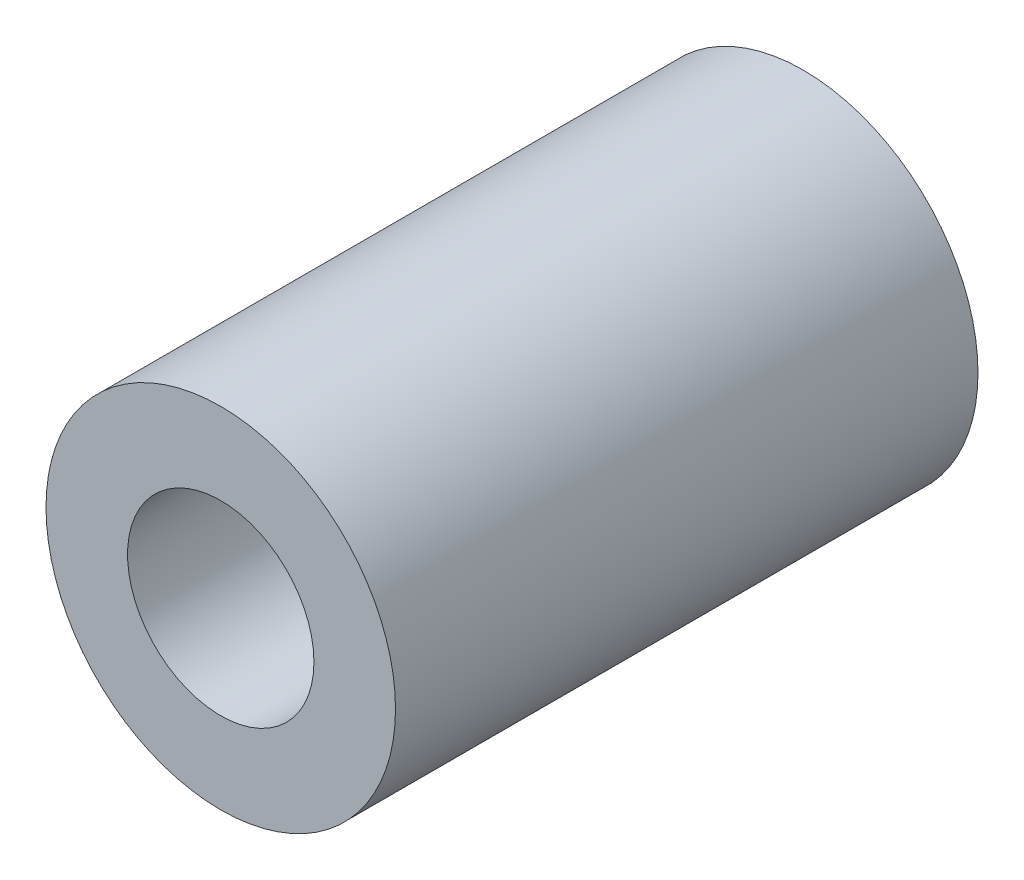
ISO-10303-21;
HEADER;
FILE_DESCRIPTION(('STEP AP214'),'2;1');
FILE_NAME('part.step','',(''),(''),'','','');
FILE_SCHEMA(('AUTOMOTIVE_DESIGN { 1 0 10303 214 1 1 1 1 }'));
ENDSEC;
DATA;
#1=APPLICATION_CONTEXT('core data for automotive mechanical design processes');
#2=APPLICATION_PROTOCOL_DEFINITION('international standard','automotive_design',2000,#1);
#3=PRODUCT_CONTEXT('',#1,'mechanical');
#4=PRODUCT('Part','Part','',(#3));
#5=PRODUCT_RELATED_PRODUCT_CATEGORY('part','',(#4));
#6=PRODUCT_DEFINITION_FORMATION('','',#4);
#7=PRODUCT_DEFINITION_CONTEXT('part definition',#1,'design');
#8=PRODUCT_DEFINITION('design','',#6,#7);
#9=PRODUCT_DEFINITION_SHAPE('','',#8);
#10=(LENGTH_UNIT() NAMED_UNIT(*) SI_UNIT(.MILLI.,.METRE.));
#11=(NAMED_UNIT(*) PLANE_ANGLE_UNIT() SI_UNIT($,.RADIAN.));
#12=(NAMED_UNIT(*) SI_UNIT($,.STERADIAN.) SOLID_ANGLE_UNIT());
#13=UNCERTAINTY_MEASURE_WITH_UNIT(LENGTH_MEASURE(1.E-05),#10,'distance_accuracy_value','');
#14=(GEOMETRIC_REPRESENTATION_CONTEXT(3) GLOBAL_UNCERTAINTY_ASSIGNED_CONTEXT((#13)) GLOBAL_UNIT_ASSIGNED_CONTEXT((#10,
#11,#12)) REPRESENTATION_CONTEXT('',''));
#15=CARTESIAN_POINT('',(0.,0.,0.));
#16=DIRECTION('',(0.,0.,1.));
#17=DIRECTION('',(1.,0.,0.));
#18=AXIS2_PLACEMENT_3D('',#15,#16,#17);
#19=CARTESIAN_POINT('',(0.,0.,10.));
#20=DIRECTION('',(0.,0.,1.));
#21=DIRECTION('',(1.,0.,0.));
#22=AXIS2_PLACEMENT_3D('',#19,#20,#21);
#23=PLANE('',#22);
#24=CARTESIAN_POINT('',(0.,0.,10.));
#25=DIRECTION('',(0.,0.,1.));
#26=DIRECTION('',(1.,0.,0.));
#27=AXIS2_PLACEMENT_3D('',#24,#25,#26);
#28=CIRCLE('',#27,3.);
#29=CARTESIAN_POINT('',(3.,0.,10.));
#30=VERTEX_POINT('',#29);
#31=EDGE_CURVE('E10',#30,#30,#28,.T.);
#32=ORIENTED_EDGE('',*,*,#31,.T.);
#33=EDGE_LOOP('',(#32));
#34=FACE_BOUND('',#33,.T.);
#35=CARTESIAN_POINT('',(0.,0.,10.));
#36=DIRECTION('',(0.,0.,1.));
#37=DIRECTION('',(1.,0.,0.));
#38=AXIS2_PLACEMENT_3D('',#35,#36,#37);
#39=CIRCLE('',#38,1.6);
#40=CARTESIAN_POINT('',(1.6,0.,10.));
#41=VERTEX_POINT('',#40);
#42=EDGE_CURVE('E48',#41,#41,#39,.T.);
#43=ORIENTED_EDGE('',*,*,#42,.F.);
#44=EDGE_LOOP('',(#43));
#45=FACE_BOUND('',#44,.T.);
#46=ADVANCED_FACE('F37',(#34,#45),#23,.T.);
#47=CARTESIAN_POINT('',(0.,0.,0.));
#48=DIRECTION('',(0.,0.,1.));
#49=DIRECTION('',(1.,0.,0.));
#50=AXIS2_PLACEMENT_3D('',#47,#48,#49);
#51=PLANE('',#50);
#52=CARTESIAN_POINT('',(0.,0.,0.));
#53=DIRECTION('',(0.,0.,1.));
#54=DIRECTION('',(1.,0.,0.));
#55=AXIS2_PLACEMENT_3D('',#52,#53,#54);
#56=CIRCLE('',#55,3.);
#57=CARTESIAN_POINT('',(3.,0.,0.));
#58=VERTEX_POINT('',#57);
#59=EDGE_CURVE('E41',#58,#58,#56,.T.);
#60=ORIENTED_EDGE('',*,*,#59,.F.);
#61=EDGE_LOOP('',(#60));
#62=FACE_BOUND('',#61,.T.);
#63=CARTESIAN_POINT('',(0.,0.,0.));
#64=DIRECTION('',(0.,0.,1.));
#65=DIRECTION('',(1.,0.,0.));
#66=AXIS2_PLACEMENT_3D('',#63,#64,#65);
#67=CIRCLE('',#66,1.6);
#68=CARTESIAN_POINT('',(1.6,0.,0.));
#69=VERTEX_POINT('',#68);
#70=EDGE_CURVE('E50',#69,#69,#67,.T.);
#71=ORIENTED_EDGE('',*,*,#70,.T.);
#72=EDGE_LOOP('',(#71));
#73=FACE_BOUND('',#72,.T.);
#74=ADVANCED_FACE('F60',(#62,#73),#51,.F.);
#75=CARTESIAN_POINT('',(0.,0.,10.));
#76=DIRECTION('',(0.,0.,-1.));
#77=DIRECTION('',(-1.,0.,0.));
#78=AXIS2_PLACEMENT_3D('',#75,#76,#77);
#79=CYLINDRICAL_SURFACE('',#78,3.);
#80=ORIENTED_EDGE('',*,*,#31,.F.);
#81=EDGE_LOOP('',(#80));
#82=FACE_BOUND('',#81,.T.);
#83=ORIENTED_EDGE('',*,*,#59,.T.);
#84=EDGE_LOOP('',(#83));
#85=FACE_BOUND('',#84,.T.);
#86=ADVANCED_FACE('F39',(#82,#85),#79,.T.);
#87=CARTESIAN_POINT('',(0.,0.,10.));
#88=DIRECTION('',(0.,0.,-1.));
#89=DIRECTION('',(-1.,0.,0.));
#90=AXIS2_PLACEMENT_3D('',#87,#88,#89);
#91=CYLINDRICAL_SURFACE('',#90,1.6);
#92=ORIENTED_EDGE('',*,*,#42,.T.);
#93=EDGE_LOOP('',(#92));
#94=FACE_BOUND('',#93,.T.);
#95=ORIENTED_EDGE('',*,*,#70,.F.);
#96=EDGE_LOOP('',(#95));
#97=FACE_BOUND('',#96,.T.);
#98=ADVANCED_FACE('F56',(#94,#97),#91,.F.);
#99=CLOSED_SHELL('',(#46,#74,#86,#98));
#100=MANIFOLD_SOLID_BREP('B2',#99);
#101=ADVANCED_BREP_SHAPE_REPRESENTATION('',(#18,#100),#14);
#102=SHAPE_DEFINITION_REPRESENTATION(#9,#101);
ENDSEC;
END-ISO-10303-21;
